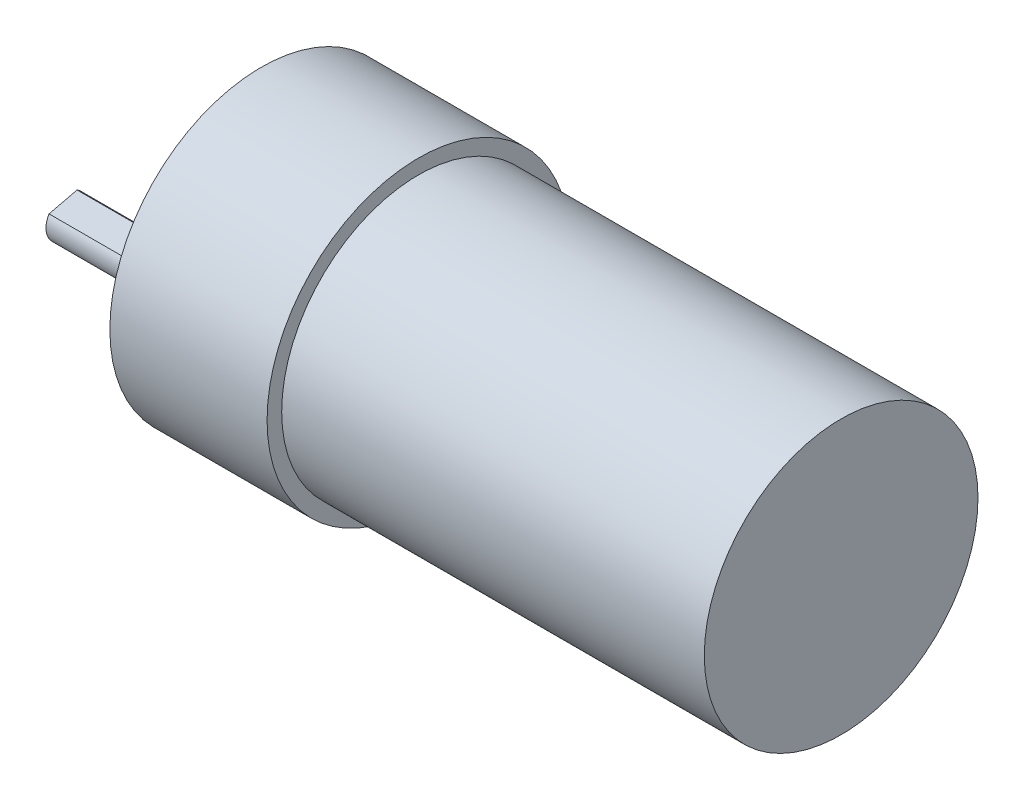
ISO-10303-21;
HEADER;
FILE_DESCRIPTION(('STEP AP214'),'2;1');
FILE_NAME('part.step','',(''),(''),'','','');
FILE_SCHEMA(('AUTOMOTIVE_DESIGN { 1 0 10303 214 1 1 1 1 }'));
ENDSEC;
DATA;
#1=APPLICATION_CONTEXT('core data for automotive mechanical design processes');
#2=APPLICATION_PROTOCOL_DEFINITION('international standard','automotive_design',2000,#1);
#3=PRODUCT_CONTEXT('',#1,'mechanical');
#4=PRODUCT('Part','Part','',(#3));
#5=PRODUCT_RELATED_PRODUCT_CATEGORY('part','',(#4));
#6=PRODUCT_DEFINITION_FORMATION('','',#4);
#7=PRODUCT_DEFINITION_CONTEXT('part definition',#1,'design');
#8=PRODUCT_DEFINITION('design','',#6,#7);
#9=PRODUCT_DEFINITION_SHAPE('','',#8);
#10=(LENGTH_UNIT() NAMED_UNIT(*) SI_UNIT(.MILLI.,.METRE.));
#11=(NAMED_UNIT(*) PLANE_ANGLE_UNIT() SI_UNIT($,.RADIAN.));
#12=(NAMED_UNIT(*) SI_UNIT($,.STERADIAN.) SOLID_ANGLE_UNIT());
#13=UNCERTAINTY_MEASURE_WITH_UNIT(LENGTH_MEASURE(1.E-05),#10,'distance_accuracy_value','');
#14=(GEOMETRIC_REPRESENTATION_CONTEXT(3) GLOBAL_UNCERTAINTY_ASSIGNED_CONTEXT((#13)) GLOBAL_UNIT_ASSIGNED_CONTEXT((#10,
#11,#12)) REPRESENTATION_CONTEXT('',''));
#15=CARTESIAN_POINT('',(0.,0.,0.));
#16=DIRECTION('',(0.,0.,1.));
#17=DIRECTION('',(1.,0.,0.));
#18=AXIS2_PLACEMENT_3D('',#15,#16,#17);
#19=CARTESIAN_POINT('',(-40.8432,-8.71855,0.));
#20=DIRECTION('',(1.,0.,0.));
#21=DIRECTION('',(0.,0.,-1.));
#22=AXIS2_PLACEMENT_3D('',#19,#20,#21);
#23=CYLINDRICAL_SURFACE('',#22,2.3749);
#24=CARTESIAN_POINT('',(-18.2372,-8.71855,0.));
#25=DIRECTION('',(-1.,0.,0.));
#26=DIRECTION('',(0.,0.,1.));
#27=AXIS2_PLACEMENT_3D('',#24,#25,#26);
#28=CIRCLE('',#27,2.3749);
#29=CARTESIAN_POINT('',(-18.2372,-8.71855,2.3749));
#30=VERTEX_POINT('',#29);
#31=EDGE_CURVE('E86',#30,#30,#28,.T.);
#32=ORIENTED_EDGE('',*,*,#31,.T.);
#33=EDGE_LOOP('',(#32));
#34=FACE_BOUND('',#33,.T.);
#35=DIRECTION('',(1.,0.,0.));
#36=VECTOR('',#35,1.);
#37=CARTESIAN_POINT('',(-40.8432,-6.68747817064265,-1.23081161596361));
#38=LINE('',#37,#36);
#39=CARTESIAN_POINT('',(-25.8572,-6.68747817064265,-1.23081161596361));
#40=VERTEX_POINT('',#39);
#41=CARTESIAN_POINT('',(-40.8432,-6.68747817064265,-1.23081161596361));
#42=VERTEX_POINT('',#41);
#43=EDGE_CURVE('E47',#40,#42,#38,.F.);
#44=ORIENTED_EDGE('',*,*,#43,.F.);
#45=CARTESIAN_POINT('',(-25.8572,-8.71855,0.));
#46=DIRECTION('',(1.,0.,0.));
#47=DIRECTION('',(0.,0.,-1.));
#48=AXIS2_PLACEMENT_3D('',#45,#46,#47);
#49=CIRCLE('',#48,2.3749);
#50=CARTESIAN_POINT('',(-25.8572,-7.46406700754952,2.01653723785416));
#51=VERTEX_POINT('',#50);
#52=EDGE_CURVE('E11',#40,#51,#49,.T.);
#53=ORIENTED_EDGE('',*,*,#52,.T.);
#54=DIRECTION('',(1.,0.,0.));
#55=VECTOR('',#54,1.);
#56=CARTESIAN_POINT('',(-40.8432,-7.46406700754952,2.01653723785416));
#57=LINE('',#56,#55);
#58=CARTESIAN_POINT('',(-40.8432,-7.46406700754952,2.01653723785416));
#59=VERTEX_POINT('',#58);
#60=EDGE_CURVE('E56',#59,#51,#57,.T.);
#61=ORIENTED_EDGE('',*,*,#60,.F.);
#62=CARTESIAN_POINT('',(-40.8432,-8.71855,0.));
#63=DIRECTION('',(-1.,0.,0.));
#64=DIRECTION('',(0.,0.,1.));
#65=AXIS2_PLACEMENT_3D('',#62,#63,#64);
#66=CIRCLE('',#65,2.3749);
#67=EDGE_CURVE('E68',#42,#59,#66,.T.);
#68=ORIENTED_EDGE('',*,*,#67,.F.);
#69=EDGE_LOOP('',(#44,#53,#61,#68));
#70=FACE_BOUND('',#69,.T.);
#71=ADVANCED_FACE('F32',(#34,#70),#23,.T.);
#72=CARTESIAN_POINT('',(-40.8432,-8.71855,0.));
#73=DIRECTION('',(-1.,0.,0.));
#74=DIRECTION('',(0.,0.,1.));
#75=AXIS2_PLACEMENT_3D('',#72,#73,#74);
#76=PLANE('',#75);
#77=ORIENTED_EDGE('',*,*,#67,.T.);
#78=DIRECTION('',(0.,0.232587064676617,-0.972575579245703));
#79=VECTOR('',#78,1.);
#80=CARTESIAN_POINT('',(-40.8432,-7.07577258909608,0.392862810945275));
#81=LINE('',#80,#79);
#82=EDGE_CURVE('E40',#59,#42,#81,.T.);
#83=ORIENTED_EDGE('',*,*,#82,.T.);
#84=EDGE_LOOP('',(#77,#83));
#85=FACE_BOUND('',#84,.T.);
#86=ADVANCED_FACE('F104',(#85),#76,.T.);
#87=CARTESIAN_POINT('',(-18.2372,0.,0.));
#88=DIRECTION('',(-1.,0.,0.));
#89=DIRECTION('',(0.,0.,1.));
#90=AXIS2_PLACEMENT_3D('',#87,#88,#89);
#91=PLANE('',#90);
#92=CARTESIAN_POINT('',(-18.2372,-8.71855,-10.2108));
#93=DIRECTION('',(-1.,0.,0.));
#94=DIRECTION('',(0.,0.,1.));
#95=AXIS2_PLACEMENT_3D('',#92,#93,#94);
#96=CIRCLE('',#95,1.27);
#97=CARTESIAN_POINT('',(-18.2372,-8.71855,-8.9408));
#98=VERTEX_POINT('',#97);
#99=EDGE_CURVE('E63',#98,#98,#96,.T.);
#100=ORIENTED_EDGE('',*,*,#99,.F.);
#101=EDGE_LOOP('',(#100));
#102=FACE_BOUND('',#101,.T.);
#103=CARTESIAN_POINT('',(-18.2372,-8.71855,10.2108));
#104=DIRECTION('',(-1.,0.,0.));
#105=DIRECTION('',(0.,0.,1.));
#106=AXIS2_PLACEMENT_3D('',#103,#104,#105);
#107=CIRCLE('',#106,1.27);
#108=CARTESIAN_POINT('',(-18.2372,-8.71855,11.4808));
#109=VERTEX_POINT('',#108);
#110=EDGE_CURVE('E74',#109,#109,#107,.T.);
#111=ORIENTED_EDGE('',*,*,#110,.F.);
#112=EDGE_LOOP('',(#111));
#113=FACE_BOUND('',#112,.T.);
#114=CARTESIAN_POINT('',(-18.2372,13.45565,0.));
#115=DIRECTION('',(-1.,0.,0.));
#116=DIRECTION('',(0.,0.,1.));
#117=AXIS2_PLACEMENT_3D('',#114,#115,#116);
#118=CIRCLE('',#117,1.27);
#119=CARTESIAN_POINT('',(-18.2372,13.45565,1.27));
#120=VERTEX_POINT('',#119);
#121=EDGE_CURVE('E80',#120,#120,#118,.T.);
#122=ORIENTED_EDGE('',*,*,#121,.F.);
#123=EDGE_LOOP('',(#122));
#124=FACE_BOUND('',#123,.T.);
#125=CARTESIAN_POINT('',(-18.2372,0.,0.));
#126=DIRECTION('',(-1.,0.,0.));
#127=DIRECTION('',(0.,0.,1.));
#128=AXIS2_PLACEMENT_3D('',#125,#126,#127);
#129=CIRCLE('',#128,17.56918);
#130=CARTESIAN_POINT('',(-18.2372,0.,17.56918));
#131=VERTEX_POINT('',#130);
#132=EDGE_CURVE('E93',#131,#131,#129,.T.);
#133=ORIENTED_EDGE('',*,*,#132,.T.);
#134=EDGE_LOOP('',(#133));
#135=FACE_BOUND('',#134,.T.);
#136=ORIENTED_EDGE('',*,*,#31,.F.);
#137=EDGE_LOOP('',(#136));
#138=FACE_BOUND('',#137,.T.);
#139=ADVANCED_FACE('F106',(#102,#113,#124,#135,#138),#91,.T.);
#140=CARTESIAN_POINT('',(49.022,0.,0.));
#141=DIRECTION('',(-1.,0.,0.));
#142=DIRECTION('',(0.,0.,1.));
#143=AXIS2_PLACEMENT_3D('',#140,#141,#142);
#144=CYLINDRICAL_SURFACE('',#143,15.875);
#145=CARTESIAN_POINT('',(49.022,0.,0.));
#146=DIRECTION('',(1.,0.,0.));
#147=DIRECTION('',(0.,0.,-1.));
#148=AXIS2_PLACEMENT_3D('',#145,#146,#147);
#149=CIRCLE('',#148,15.875);
#150=CARTESIAN_POINT('',(49.022,0.,-15.875));
#151=VERTEX_POINT('',#150);
#152=EDGE_CURVE('E101',#151,#151,#149,.T.);
#153=ORIENTED_EDGE('',*,*,#152,.F.);
#154=EDGE_LOOP('',(#153));
#155=FACE_BOUND('',#154,.T.);
#156=CARTESIAN_POINT('',(0.,0.,0.));
#157=DIRECTION('',(-1.,0.,0.));
#158=DIRECTION('',(0.,0.,1.));
#159=AXIS2_PLACEMENT_3D('',#156,#157,#158);
#160=CIRCLE('',#159,15.875);
#161=CARTESIAN_POINT('',(0.,0.,15.875));
#162=VERTEX_POINT('',#161);
#163=EDGE_CURVE('E96',#162,#162,#160,.T.);
#164=ORIENTED_EDGE('',*,*,#163,.F.);
#165=EDGE_LOOP('',(#164));
#166=FACE_BOUND('',#165,.T.);
#167=ADVANCED_FACE('F34',(#155,#166),#144,.T.);
#168=CARTESIAN_POINT('',(49.022,0.,0.));
#169=DIRECTION('',(1.,0.,0.));
#170=DIRECTION('',(0.,0.,-1.));
#171=AXIS2_PLACEMENT_3D('',#168,#169,#170);
#172=PLANE('',#171);
#173=ORIENTED_EDGE('',*,*,#152,.T.);
#174=EDGE_LOOP('',(#173));
#175=FACE_BOUND('',#174,.T.);
#176=ADVANCED_FACE('F124',(#175),#172,.T.);
#177=CARTESIAN_POINT('',(0.,0.,0.));
#178=DIRECTION('',(-1.,0.,0.));
#179=DIRECTION('',(0.,0.,1.));
#180=AXIS2_PLACEMENT_3D('',#177,#178,#179);
#181=PLANE('',#180);
#182=CARTESIAN_POINT('',(0.,0.,0.));
#183=DIRECTION('',(-1.,0.,0.));
#184=DIRECTION('',(0.,0.,1.));
#185=AXIS2_PLACEMENT_3D('',#182,#183,#184);
#186=CIRCLE('',#185,17.56918);
#187=CARTESIAN_POINT('',(0.,0.,17.56918));
#188=VERTEX_POINT('',#187);
#189=EDGE_CURVE('E90',#188,#188,#186,.T.);
#190=ORIENTED_EDGE('',*,*,#189,.F.);
#191=EDGE_LOOP('',(#190));
#192=FACE_BOUND('',#191,.T.);
#193=ORIENTED_EDGE('',*,*,#163,.T.);
#194=EDGE_LOOP('',(#193));
#195=FACE_BOUND('',#194,.T.);
#196=ADVANCED_FACE('F120',(#192,#195),#181,.F.);
#197=CARTESIAN_POINT('',(-18.2372,0.,0.));
#198=DIRECTION('',(1.,0.,0.));
#199=DIRECTION('',(0.,0.,-1.));
#200=AXIS2_PLACEMENT_3D('',#197,#198,#199);
#201=CYLINDRICAL_SURFACE('',#200,17.56918);
#202=ORIENTED_EDGE('',*,*,#132,.F.);
#203=EDGE_LOOP('',(#202));
#204=FACE_BOUND('',#203,.T.);
#205=ORIENTED_EDGE('',*,*,#189,.T.);
#206=EDGE_LOOP('',(#205));
#207=FACE_BOUND('',#206,.T.);
#208=ADVANCED_FACE('F123',(#204,#207),#201,.T.);
#209=CARTESIAN_POINT('',(-8.2372,13.45565,0.));
#210=DIRECTION('',(-1.,0.,0.));
#211=DIRECTION('',(0.,0.,1.));
#212=AXIS2_PLACEMENT_3D('',#209,#210,#211);
#213=CYLINDRICAL_SURFACE('',#212,1.27);
#214=CARTESIAN_POINT('',(-8.2372,13.45565,0.));
#215=DIRECTION('',(-1.,0.,0.));
#216=DIRECTION('',(0.,0.,1.));
#217=AXIS2_PLACEMENT_3D('',#214,#215,#216);
#218=CIRCLE('',#217,1.27);
#219=CARTESIAN_POINT('',(-8.2372,13.45565,1.27));
#220=VERTEX_POINT('',#219);
#221=EDGE_CURVE('E83',#220,#220,#218,.T.);
#222=ORIENTED_EDGE('',*,*,#221,.F.);
#223=EDGE_LOOP('',(#222));
#224=FACE_BOUND('',#223,.T.);
#225=ORIENTED_EDGE('',*,*,#121,.T.);
#226=EDGE_LOOP('',(#225));
#227=FACE_BOUND('',#226,.T.);
#228=ADVANCED_FACE('F117',(#224,#227),#213,.F.);
#229=CARTESIAN_POINT('',(-8.2372,13.45565,0.));
#230=DIRECTION('',(-1.,0.,0.));
#231=DIRECTION('',(0.,0.,1.));
#232=AXIS2_PLACEMENT_3D('',#229,#230,#231);
#233=PLANE('',#232);
#234=ORIENTED_EDGE('',*,*,#221,.T.);
#235=EDGE_LOOP('',(#234));
#236=FACE_BOUND('',#235,.T.);
#237=ADVANCED_FACE('F152',(#236),#233,.T.);
#238=CARTESIAN_POINT('',(-8.2372,-8.71855,10.2108));
#239=DIRECTION('',(-1.,0.,0.));
#240=DIRECTION('',(0.,0.,1.));
#241=AXIS2_PLACEMENT_3D('',#238,#239,#240);
#242=CYLINDRICAL_SURFACE('',#241,1.27);
#243=CARTESIAN_POINT('',(-8.2372,-8.71855,10.2108));
#244=DIRECTION('',(-1.,0.,0.));
#245=DIRECTION('',(0.,0.,1.));
#246=AXIS2_PLACEMENT_3D('',#243,#244,#245);
#247=CIRCLE('',#246,1.27);
#248=CARTESIAN_POINT('',(-8.2372,-8.71855,11.4808));
#249=VERTEX_POINT('',#248);
#250=EDGE_CURVE('E77',#249,#249,#247,.T.);
#251=ORIENTED_EDGE('',*,*,#250,.F.);
#252=EDGE_LOOP('',(#251));
#253=FACE_BOUND('',#252,.T.);
#254=ORIENTED_EDGE('',*,*,#110,.T.);
#255=EDGE_LOOP('',(#254));
#256=FACE_BOUND('',#255,.T.);
#257=ADVANCED_FACE('F157',(#253,#256),#242,.F.);
#258=CARTESIAN_POINT('',(-8.2372,-8.71855,10.2108));
#259=DIRECTION('',(-1.,0.,0.));
#260=DIRECTION('',(0.,0.,1.));
#261=AXIS2_PLACEMENT_3D('',#258,#259,#260);
#262=PLANE('',#261);
#263=ORIENTED_EDGE('',*,*,#250,.T.);
#264=EDGE_LOOP('',(#263));
#265=FACE_BOUND('',#264,.T.);
#266=ADVANCED_FACE('F162',(#265),#262,.T.);
#267=CARTESIAN_POINT('',(-8.2372,-8.71855,-10.2108));
#268=DIRECTION('',(-1.,0.,0.));
#269=DIRECTION('',(0.,0.,1.));
#270=AXIS2_PLACEMENT_3D('',#267,#268,#269);
#271=CYLINDRICAL_SURFACE('',#270,1.27);
#272=CARTESIAN_POINT('',(-8.2372,-8.71855,-10.2108));
#273=DIRECTION('',(-1.,0.,0.));
#274=DIRECTION('',(0.,0.,1.));
#275=AXIS2_PLACEMENT_3D('',#272,#273,#274);
#276=CIRCLE('',#275,1.27);
#277=CARTESIAN_POINT('',(-8.2372,-8.71855,-8.9408));
#278=VERTEX_POINT('',#277);
#279=EDGE_CURVE('E71',#278,#278,#276,.T.);
#280=ORIENTED_EDGE('',*,*,#279,.F.);
#281=EDGE_LOOP('',(#280));
#282=FACE_BOUND('',#281,.T.);
#283=ORIENTED_EDGE('',*,*,#99,.T.);
#284=EDGE_LOOP('',(#283));
#285=FACE_BOUND('',#284,.T.);
#286=ADVANCED_FACE('F172',(#282,#285),#271,.F.);
#287=CARTESIAN_POINT('',(-8.2372,-8.71855,-10.2108));
#288=DIRECTION('',(-1.,0.,0.));
#289=DIRECTION('',(0.,0.,1.));
#290=AXIS2_PLACEMENT_3D('',#287,#288,#289);
#291=PLANE('',#290);
#292=ORIENTED_EDGE('',*,*,#279,.T.);
#293=EDGE_LOOP('',(#292));
#294=FACE_BOUND('',#293,.T.);
#295=ADVANCED_FACE('F182',(#294),#291,.T.);
#296=CARTESIAN_POINT('',(-25.8572,-8.21958385216718,5.17577239912827));
#297=DIRECTION('',(1.,0.,0.));
#298=DIRECTION('',(0.,0.,-1.));
#299=AXIS2_PLACEMENT_3D('',#296,#297,#298);
#300=PLANE('',#299);
#301=DIRECTION('',(0.,0.232587064676617,-0.972575579245703));
#302=VECTOR('',#301,1.);
#303=CARTESIAN_POINT('',(-25.8572,-8.21958385216718,5.17577239912827));
#304=LINE('',#303,#302);
#305=EDGE_CURVE('E59',#51,#40,#304,.T.);
#306=ORIENTED_EDGE('',*,*,#305,.F.);
#307=ORIENTED_EDGE('',*,*,#52,.F.);
#308=EDGE_LOOP('',(#306,#307));
#309=FACE_BOUND('',#308,.T.);
#310=ADVANCED_FACE('F66',(#309),#300,.F.);
#311=CARTESIAN_POINT('',(-25.8572,-5.65789785603313,-5.5360582222337));
#312=DIRECTION('',(0.,0.972575579245703,0.232587064676617));
#313=DIRECTION('',(0.,-0.232587064676617,0.972575579245703));
#314=AXIS2_PLACEMENT_3D('',#311,#312,#313);
#315=PLANE('',#314);
#316=ORIENTED_EDGE('',*,*,#60,.T.);
#317=ORIENTED_EDGE('',*,*,#305,.T.);
#318=ORIENTED_EDGE('',*,*,#43,.T.);
#319=ORIENTED_EDGE('',*,*,#82,.F.);
#320=EDGE_LOOP('',(#316,#317,#318,#319));
#321=FACE_BOUND('',#320,.T.);
#322=ADVANCED_FACE('F58',(#321),#315,.T.);
#323=CLOSED_SHELL('',(#71,#86,#139,#167,#176,#196,#208,#228,#237,#257,#266,#286,#295,#310,#322));
#324=MANIFOLD_SOLID_BREP('B2',#323);
#325=ADVANCED_BREP_SHAPE_REPRESENTATION('',(#18,#324),#14);
#326=SHAPE_DEFINITION_REPRESENTATION(#9,#325);
ENDSEC;
END-ISO-10303-21;
